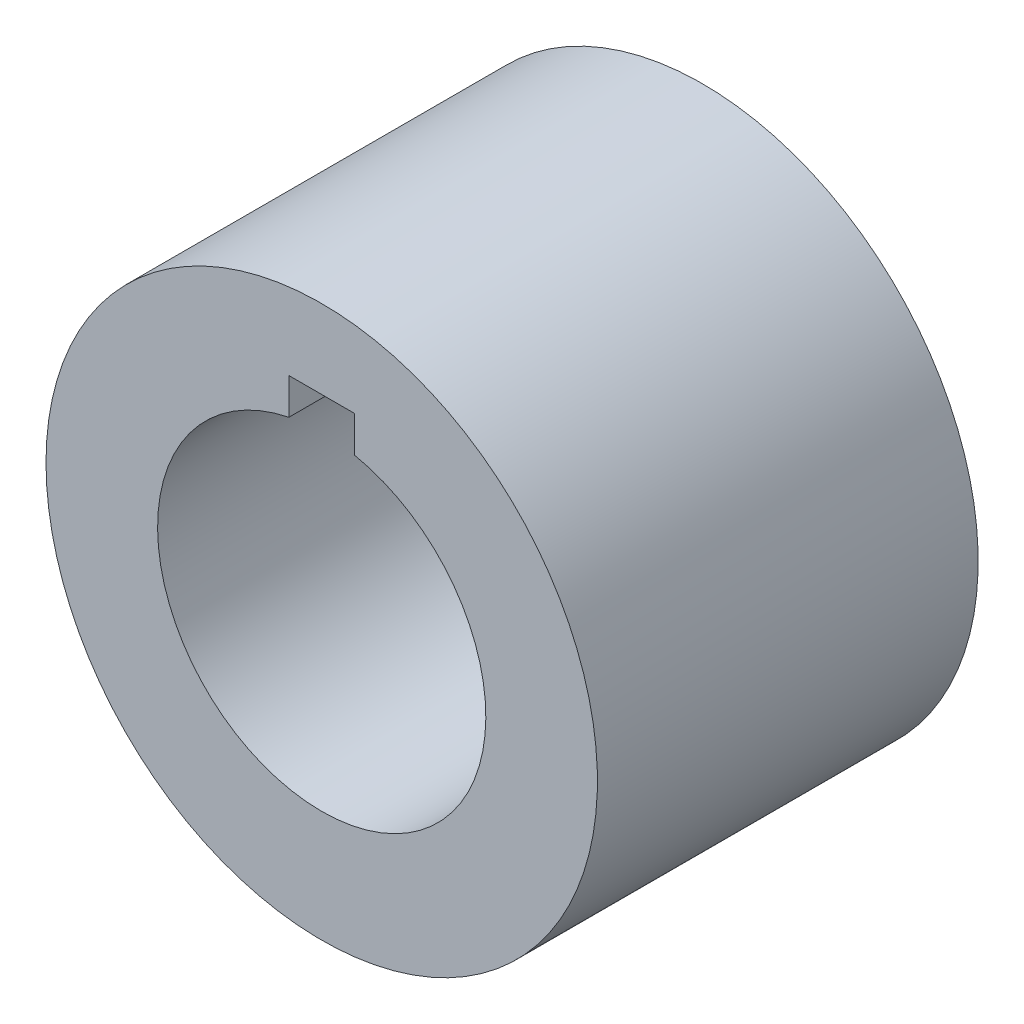
ISO-10303-21;
HEADER;
FILE_DESCRIPTION(('STEP AP214'),'2;1');
FILE_NAME('part.step','',(''),(''),'','','');
FILE_SCHEMA(('AUTOMOTIVE_DESIGN { 1 0 10303 214 1 1 1 1 }'));
ENDSEC;
DATA;
#1=APPLICATION_CONTEXT('core data for automotive mechanical design processes');
#2=APPLICATION_PROTOCOL_DEFINITION('international standard','automotive_design',2000,#1);
#3=PRODUCT_CONTEXT('',#1,'mechanical');
#4=PRODUCT('Part','Part','',(#3));
#5=PRODUCT_RELATED_PRODUCT_CATEGORY('part','',(#4));
#6=PRODUCT_DEFINITION_FORMATION('','',#4);
#7=PRODUCT_DEFINITION_CONTEXT('part definition',#1,'design');
#8=PRODUCT_DEFINITION('design','',#6,#7);
#9=PRODUCT_DEFINITION_SHAPE('','',#8);
#10=(LENGTH_UNIT() NAMED_UNIT(*) SI_UNIT(.MILLI.,.METRE.));
#11=(NAMED_UNIT(*) PLANE_ANGLE_UNIT() SI_UNIT($,.RADIAN.));
#12=(NAMED_UNIT(*) SI_UNIT($,.STERADIAN.) SOLID_ANGLE_UNIT());
#13=UNCERTAINTY_MEASURE_WITH_UNIT(LENGTH_MEASURE(1.E-05),#10,'distance_accuracy_value','');
#14=(GEOMETRIC_REPRESENTATION_CONTEXT(3) GLOBAL_UNCERTAINTY_ASSIGNED_CONTEXT((#13)) GLOBAL_UNIT_ASSIGNED_CONTEXT((#10,
#11,#12)) REPRESENTATION_CONTEXT('',''));
#15=CARTESIAN_POINT('',(0.,0.,0.));
#16=DIRECTION('',(0.,0.,1.));
#17=DIRECTION('',(1.,0.,0.));
#18=AXIS2_PLACEMENT_3D('',#15,#16,#17);
#19=CARTESIAN_POINT('',(0.,0.,29.));
#20=DIRECTION('',(0.,0.,1.));
#21=DIRECTION('',(1.,0.,0.));
#22=AXIS2_PLACEMENT_3D('',#19,#20,#21);
#23=PLANE('',#22);
#24=DIRECTION('',(0.,1.,0.));
#25=VECTOR('',#24,1.);
#26=CARTESIAN_POINT('',(2.5,15.,29.));
#27=LINE('',#26,#25);
#28=CARTESIAN_POINT('',(2.5,12.2474487139159,29.));
#29=VERTEX_POINT('',#28);
#30=CARTESIAN_POINT('',(2.5,15.,29.));
#31=VERTEX_POINT('',#30);
#32=EDGE_CURVE('E107',#29,#31,#27,.T.);
#33=ORIENTED_EDGE('',*,*,#32,.F.);
#34=CARTESIAN_POINT('',(0.,0.,29.));
#35=DIRECTION('',(0.,0.,1.));
#36=DIRECTION('',(1.,0.,0.));
#37=AXIS2_PLACEMENT_3D('',#34,#35,#36);
#38=CIRCLE('',#37,12.5);
#39=CARTESIAN_POINT('',(-2.5,12.2474487139159,29.));
#40=VERTEX_POINT('',#39);
#41=EDGE_CURVE('E125',#40,#29,#38,.T.);
#42=ORIENTED_EDGE('',*,*,#41,.F.);
#43=DIRECTION('',(0.,-1.,0.));
#44=VECTOR('',#43,1.);
#45=CARTESIAN_POINT('',(-2.5,15.,29.));
#46=LINE('',#45,#44);
#47=CARTESIAN_POINT('',(-2.5,15.,29.));
#48=VERTEX_POINT('',#47);
#49=EDGE_CURVE('E104',#48,#40,#46,.T.);
#50=ORIENTED_EDGE('',*,*,#49,.F.);
#51=DIRECTION('',(-1.,0.,0.));
#52=VECTOR('',#51,1.);
#53=CARTESIAN_POINT('',(-2.5,15.,29.));
#54=LINE('',#53,#52);
#55=EDGE_CURVE('E96',#31,#48,#54,.T.);
#56=ORIENTED_EDGE('',*,*,#55,.F.);
#57=EDGE_LOOP('',(#33,#42,#50,#56));
#58=FACE_BOUND('',#57,.T.);
#59=CARTESIAN_POINT('',(0.,0.,29.));
#60=DIRECTION('',(0.,0.,1.));
#61=DIRECTION('',(1.,0.,0.));
#62=AXIS2_PLACEMENT_3D('',#59,#60,#61);
#63=CIRCLE('',#62,21.);
#64=CARTESIAN_POINT('',(-21.,0.,29.));
#65=VERTEX_POINT('',#64);
#66=EDGE_CURVE('E132',#65,#65,#63,.T.);
#67=ORIENTED_EDGE('',*,*,#66,.T.);
#68=EDGE_LOOP('',(#67));
#69=FACE_BOUND('',#68,.T.);
#70=ADVANCED_FACE('F39',(#58,#69),#23,.T.);
#71=CARTESIAN_POINT('',(0.,0.,0.));
#72=DIRECTION('',(0.,0.,1.));
#73=DIRECTION('',(1.,0.,0.));
#74=AXIS2_PLACEMENT_3D('',#71,#72,#73);
#75=PLANE('',#74);
#76=CARTESIAN_POINT('',(0.,0.,0.));
#77=DIRECTION('',(0.,0.,1.));
#78=DIRECTION('',(1.,0.,0.));
#79=AXIS2_PLACEMENT_3D('',#76,#77,#78);
#80=CIRCLE('',#79,21.);
#81=CARTESIAN_POINT('',(-21.,0.,0.));
#82=VERTEX_POINT('',#81);
#83=EDGE_CURVE('E128',#82,#82,#80,.T.);
#84=ORIENTED_EDGE('',*,*,#83,.F.);
#85=EDGE_LOOP('',(#84));
#86=FACE_BOUND('',#85,.T.);
#87=CARTESIAN_POINT('',(0.,0.,0.));
#88=DIRECTION('',(0.,0.,1.));
#89=DIRECTION('',(1.,0.,0.));
#90=AXIS2_PLACEMENT_3D('',#87,#88,#89);
#91=CIRCLE('',#90,12.5);
#92=CARTESIAN_POINT('',(12.5,0.,0.));
#93=VERTEX_POINT('',#92);
#94=EDGE_CURVE('E123',#93,#93,#91,.T.);
#95=ORIENTED_EDGE('',*,*,#94,.T.);
#96=EDGE_LOOP('',(#95));
#97=FACE_BOUND('',#96,.T.);
#98=ADVANCED_FACE('F173',(#86,#97),#75,.F.);
#99=CARTESIAN_POINT('',(0.,0.,29.));
#100=DIRECTION('',(0.,0.,-1.));
#101=DIRECTION('',(-1.,0.,0.));
#102=AXIS2_PLACEMENT_3D('',#99,#100,#101);
#103=CYLINDRICAL_SURFACE('',#102,21.);
#104=CARTESIAN_POINT('',(-21.,0.,29.));
#105=CARTESIAN_POINT('',(-21.,0.,28.6979166666667));
#106=CARTESIAN_POINT('',(-21.,0.,28.3958333333333));
#107=CARTESIAN_POINT('',(-21.,0.,27.7916666666667));
#108=CARTESIAN_POINT('',(-21.,0.,27.4895833333333));
#109=CARTESIAN_POINT('',(-21.,0.,26.8854166666667));
#110=CARTESIAN_POINT('',(-21.,0.,26.5833333333333));
#111=CARTESIAN_POINT('',(-21.,0.,25.9791666666667));
#112=CARTESIAN_POINT('',(-21.,0.,25.6770833333333));
#113=CARTESIAN_POINT('',(-21.,0.,25.0729166666667));
#114=CARTESIAN_POINT('',(-21.,0.,24.7708333333333));
#115=CARTESIAN_POINT('',(-21.,0.,24.1666666666667));
#116=CARTESIAN_POINT('',(-21.,0.,23.8645833333333));
#117=CARTESIAN_POINT('',(-21.,0.,23.2604166666667));
#118=CARTESIAN_POINT('',(-21.,0.,22.9583333333333));
#119=CARTESIAN_POINT('',(-21.,0.,22.3541666666667));
#120=CARTESIAN_POINT('',(-21.,0.,22.0520833333333));
#121=CARTESIAN_POINT('',(-21.,0.,21.4479166666667));
#122=CARTESIAN_POINT('',(-21.,0.,21.1458333333333));
#123=CARTESIAN_POINT('',(-21.,0.,20.5416666666667));
#124=CARTESIAN_POINT('',(-21.,0.,20.2395833333333));
#125=CARTESIAN_POINT('',(-21.,0.,19.6354166666667));
#126=CARTESIAN_POINT('',(-21.,0.,19.3333333333333));
#127=CARTESIAN_POINT('',(-21.,0.,18.7291666666667));
#128=CARTESIAN_POINT('',(-21.,0.,18.4270833333333));
#129=CARTESIAN_POINT('',(-21.,0.,17.8229166666667));
#130=CARTESIAN_POINT('',(-21.,0.,17.5208333333333));
#131=CARTESIAN_POINT('',(-21.,0.,16.9166666666667));
#132=CARTESIAN_POINT('',(-21.,0.,16.6145833333333));
#133=CARTESIAN_POINT('',(-21.,0.,16.0104166666667));
#134=CARTESIAN_POINT('',(-21.,0.,15.7083333333333));
#135=CARTESIAN_POINT('',(-21.,0.,15.1041666666667));
#136=CARTESIAN_POINT('',(-21.,0.,14.8020833333333));
#137=CARTESIAN_POINT('',(-21.,0.,14.1979166666667));
#138=CARTESIAN_POINT('',(-21.,0.,13.8958333333333));
#139=CARTESIAN_POINT('',(-21.,0.,13.2916666666667));
#140=CARTESIAN_POINT('',(-21.,0.,12.9895833333333));
#141=CARTESIAN_POINT('',(-21.,0.,12.3854166666667));
#142=CARTESIAN_POINT('',(-21.,0.,12.0833333333333));
#143=CARTESIAN_POINT('',(-21.,0.,11.4791666666667));
#144=CARTESIAN_POINT('',(-21.,0.,11.1770833333333));
#145=CARTESIAN_POINT('',(-21.,0.,10.5729166666667));
#146=CARTESIAN_POINT('',(-21.,0.,10.2708333333333));
#147=CARTESIAN_POINT('',(-21.,0.,9.66666666666667));
#148=CARTESIAN_POINT('',(-21.,0.,9.36458333333333));
#149=CARTESIAN_POINT('',(-21.,0.,8.76041666666667));
#150=CARTESIAN_POINT('',(-21.,0.,8.45833333333333));
#151=CARTESIAN_POINT('',(-21.,0.,7.85416666666667));
#152=CARTESIAN_POINT('',(-21.,0.,7.55208333333333));
#153=CARTESIAN_POINT('',(-21.,0.,6.94791666666667));
#154=CARTESIAN_POINT('',(-21.,0.,6.64583333333333));
#155=CARTESIAN_POINT('',(-21.,0.,6.04166666666667));
#156=CARTESIAN_POINT('',(-21.,0.,5.73958333333333));
#157=CARTESIAN_POINT('',(-21.,0.,5.13541666666667));
#158=CARTESIAN_POINT('',(-21.,0.,4.83333333333333));
#159=CARTESIAN_POINT('',(-21.,0.,4.22916666666667));
#160=CARTESIAN_POINT('',(-21.,0.,3.92708333333333));
#161=CARTESIAN_POINT('',(-21.,0.,3.32291666666667));
#162=CARTESIAN_POINT('',(-21.,0.,3.02083333333333));
#163=CARTESIAN_POINT('',(-21.,0.,2.41666666666667));
#164=CARTESIAN_POINT('',(-21.,0.,2.11458333333333));
#165=CARTESIAN_POINT('',(-21.,0.,1.51041666666667));
#166=CARTESIAN_POINT('',(-21.,0.,1.20833333333333));
#167=CARTESIAN_POINT('',(-21.,0.,0.604166666666667));
#168=CARTESIAN_POINT('',(-21.,0.,0.302083333333333));
#169=CARTESIAN_POINT('',(-21.,0.,0.));
#170=B_SPLINE_CURVE_WITH_KNOTS('',3,(#104,#105,#106,#107,#108,#109,#110,#111,#112,#113,#114,
#115,#116,#117,#118,#119,#120,#121,#122,#123,#124,#125,#126,#127,#128,#129,#130,#131,#132,#133,
#134,#135,#136,#137,#138,#139,#140,#141,#142,#143,#144,#145,#146,#147,#148,#149,#150,#151,#152,
#153,#154,#155,#156,#157,#158,#159,#160,#161,#162,#163,#164,#165,#166,#167,#168,#169),
.UNSPECIFIED.,.F.,.F.,(4,2,2,2,2,2,2,2,2,2,2,2,2,2,2,2,2,2,2,2,2,2,2,2,2,2,2,2,2,2,2,2,4),(0.,
0.906250000000001,1.8125,2.71875,3.625,4.53125,5.4375,6.34375,7.25,8.15625,9.0625,9.96875,
10.875,11.78125,12.6875,13.59375,14.5,15.40625,16.3125,17.21875,18.125,19.03125,19.9375,
20.84375,21.75,22.65625,23.5625,24.46875,25.375,26.28125,27.1875,28.09375,29.),.UNSPECIFIED.);
#171=EDGE_CURVE('BSEAM168',#65,#82,#170,.T.);
#172=ORIENTED_EDGE('',*,*,#66,.F.);
#173=ORIENTED_EDGE('',*,*,#83,.T.);
#174=ORIENTED_EDGE('',*,*,#171,.T.);
#175=ORIENTED_EDGE('',*,*,#171,.F.);
#176=EDGE_LOOP('',(#172,#174,#173,#175));
#177=FACE_BOUND('',#176,.T.);
#178=ADVANCED_FACE('F168',(#177),#103,.T.);
#179=CARTESIAN_POINT('',(0.,0.,29.));
#180=DIRECTION('',(0.,0.,-1.));
#181=DIRECTION('',(-1.,0.,0.));
#182=AXIS2_PLACEMENT_3D('',#179,#180,#181);
#183=CYLINDRICAL_SURFACE('',#182,12.5);
#184=DIRECTION('',(0.,0.,-1.));
#185=VECTOR('',#184,1.);
#186=CARTESIAN_POINT('',(2.5,12.2474487139159,29.));
#187=LINE('',#186,#185);
#188=CARTESIAN_POINT('',(2.5,12.2474487139159,6.00000000000001));
#189=VERTEX_POINT('',#188);
#190=EDGE_CURVE('E110',#189,#29,#187,.F.);
#191=ORIENTED_EDGE('',*,*,#190,.F.);
#192=CARTESIAN_POINT('',(2.5,12.2474487139159,6.));
#193=CARTESIAN_POINT('',(2.50000755453493,12.2474426861993,5.93043388757112));
#194=CARTESIAN_POINT('',(2.49709642012808,12.2480412905018,5.86087194586643));
#195=CARTESIAN_POINT('',(2.48549536781789,12.2504031311909,5.72225987695974));
#196=CARTESIAN_POINT('',(2.47680616538598,12.2521662233842,5.65320968746011));
#197=CARTESIAN_POINT('',(2.45372579449014,12.2568087575412,5.51621544923126));
#198=CARTESIAN_POINT('',(2.43934365783788,12.2596864310724,5.44826982501945));
#199=CARTESIAN_POINT('',(2.40500480115988,12.2664687508979,5.3138739604459));
#200=CARTESIAN_POINT('',(2.38504805870512,12.2703734013241,5.24742372610192));
#201=CARTESIAN_POINT('',(2.31701335206159,12.2834691332585,5.05099699721422));
#202=CARTESIAN_POINT('',(2.26075289171316,12.2940458508606,4.92383836344421));
#203=CARTESIAN_POINT('',(2.12813168468194,12.317693059,4.68081360676116));
#204=CARTESIAN_POINT('',(2.05176831878758,12.3307638744328,4.56494895804115));
#205=CARTESIAN_POINT('',(1.87995451296325,12.3581315302874,4.34610975627201));
#206=CARTESIAN_POINT('',(1.78427688143249,12.3724416817023,4.24331492507515));
#207=CARTESIAN_POINT('',(1.57702890912138,12.400560223314,4.05511468060791));
#208=CARTESIAN_POINT('',(1.46545557207307,12.414368518296,3.96971255317299));
#209=CARTESIAN_POINT('',(1.22837080969079,12.4400737464369,3.81800765495776));
#210=CARTESIAN_POINT('',(1.10274341116264,12.4519524370665,3.75188294875678));
#211=CARTESIAN_POINT('',(0.841913818366615,12.4722989738708,3.64178355275673));
#212=CARTESIAN_POINT('',(0.70671841758775,12.4807692121105,3.59779332344854));
#213=CARTESIAN_POINT('',(0.475632170774576,12.4912961292167,3.54379632954174));
#214=CARTESIAN_POINT('',(0.381240776561996,12.4945424227324,3.52739213834566));
#215=CARTESIAN_POINT('',(0.191248149324902,12.4989018425699,3.50549034733465));
#216=CARTESIAN_POINT('',(0.0956482028037174,12.5000170718343,3.4999819952734));
#217=CARTESIAN_POINT('',(0.,12.5,3.5));
#218=B_SPLINE_CURVE_WITH_KNOTS('',3,(#192,#193,#194,#195,#196,#197,#198,#199,#200,#201,#202,
#203,#204,#205,#206,#207,#208,#209,#210,#211,#212,#213,#214,#215,#216,#217),.UNSPECIFIED.,.F.,
.F.,(4,2,2,2,2,2,2,2,2,2,2,2,4),(0.,0.208627589483974,0.417229350387237,0.625501483603755,
0.833774454800563,1.25000135900362,1.66628252035583,2.08778016170978,2.50935735882325,
2.93471348409769,3.35977056999609,3.64674172455571,3.93342954830302),.UNSPECIFIED.);
#219=CARTESIAN_POINT('',(0.,12.5,3.5));
#220=VERTEX_POINT('',#219);
#221=EDGE_CURVE('E153',#189,#220,#218,.T.);
#222=ORIENTED_EDGE('',*,*,#221,.T.);
#223=CARTESIAN_POINT('',(0.,12.5,3.5));
#224=CARTESIAN_POINT('',(-0.0695802030869723,12.5000055699289,3.49999247903647));
#225=CARTESIAN_POINT('',(-0.139156314119516,12.4994191533962,3.5029047595202));
#226=CARTESIAN_POINT('',(-0.277797519839005,12.4971035949608,3.51451061975572));
#227=CARTESIAN_POINT('',(-0.346862674146696,12.4953745885771,3.52320351388791));
#228=CARTESIAN_POINT('',(-0.483889669216019,12.4908186108826,3.54629442694215));
#229=CARTESIAN_POINT('',(-0.551853053195525,12.4879933443444,3.56068358841143));
#230=CARTESIAN_POINT('',(-0.686284662792135,12.4813281321479,3.59503989220123));
#231=CARTESIAN_POINT('',(-0.752752884312886,12.4774881837102,3.615007049802));
#232=CARTESIAN_POINT('',(-0.949236267530969,12.4645939361752,3.6830795491288));
#233=CARTESIAN_POINT('',(-1.07643295512981,12.4541615851656,3.73937337540527));
#234=CARTESIAN_POINT('',(-1.31952057156152,12.4307616960465,3.87207256823003));
#235=CARTESIAN_POINT('',(-1.43541019628972,12.4177938660234,3.94848025086869));
#236=CARTESIAN_POINT('',(-1.65422116650007,12.3905551289591,4.12033920156434));
#237=CARTESIAN_POINT('',(-1.75697048873883,12.3762704702664,4.21600767931055));
#238=CARTESIAN_POINT('',(-1.94508296444328,12.348106170118,4.42321856577606));
#239=CARTESIAN_POINT('',(-2.03044260860097,12.3342266108964,4.53476417086468));
#240=CARTESIAN_POINT('',(-2.18210203469897,12.3083071166309,4.77182360899524));
#241=CARTESIAN_POINT('',(-2.24821621796945,12.2962855880002,4.89745825115047));
#242=CARTESIAN_POINT('',(-2.35829367785653,12.275650976889,5.15830240659292));
#243=CARTESIAN_POINT('',(-2.40227281327788,12.2670354551039,5.29350498542489));
#244=CARTESIAN_POINT('',(-2.45623933103384,12.2563201506375,5.52456082344954));
#245=CARTESIAN_POINT('',(-2.47262982198914,12.2530125834783,5.61891207546966));
#246=CARTESIAN_POINT('',(-2.49451394841941,12.248568649972,5.80882685163573));
#247=CARTESIAN_POINT('',(-2.50001807649253,12.2474301930112,5.90438911905266));
#248=CARTESIAN_POINT('',(-2.5,12.2474487139159,6.));
#249=B_SPLINE_CURVE_WITH_KNOTS('',3,(#223,#224,#225,#226,#227,#228,#229,#230,#231,#232,#233,
#234,#235,#236,#237,#238,#239,#240,#241,#242,#243,#244,#245,#246,#247,#248),.UNSPECIFIED.,.F.,
.F.,(4,2,2,2,2,2,2,2,2,2,2,2,4),(0.,0.208670054655722,0.417315364055163,0.625637505285634,
0.833960217194826,1.25029655151824,1.66668084753888,2.08805424015666,2.50951258359396,
2.93491006499075,3.36000233207991,3.64685414082024,3.9334293383216),.UNSPECIFIED.);
#250=CARTESIAN_POINT('',(-2.5,12.2474487139159,6.00000000000001));
#251=VERTEX_POINT('',#250);
#252=EDGE_CURVE('E11',#220,#251,#249,.T.);
#253=ORIENTED_EDGE('',*,*,#252,.T.);
#254=DIRECTION('',(0.,0.,-1.));
#255=VECTOR('',#254,1.);
#256=CARTESIAN_POINT('',(-2.5,12.2474487139159,29.));
#257=LINE('',#256,#255);
#258=EDGE_CURVE('E136',#40,#251,#257,.T.);
#259=ORIENTED_EDGE('',*,*,#258,.F.);
#260=ORIENTED_EDGE('',*,*,#41,.T.);
#261=EDGE_LOOP('',(#191,#222,#253,#259,#260));
#262=FACE_BOUND('',#261,.T.);
#263=ORIENTED_EDGE('',*,*,#94,.F.);
#264=EDGE_LOOP('',(#263));
#265=FACE_BOUND('',#264,.T.);
#266=ADVANCED_FACE('F163',(#262,#265),#183,.F.);
#267=CARTESIAN_POINT('',(2.5,15.,3.5));
#268=DIRECTION('',(1.,0.,0.));
#269=DIRECTION('',(0.,1.,0.));
#270=AXIS2_PLACEMENT_3D('',#267,#268,#269);
#271=PLANE('',#270);
#272=DIRECTION('',(0.,0.,1.));
#273=VECTOR('',#272,1.);
#274=CARTESIAN_POINT('',(2.5,15.,3.5));
#275=LINE('',#274,#273);
#276=CARTESIAN_POINT('',(2.5,15.,6.));
#277=VERTEX_POINT('',#276);
#278=EDGE_CURVE('E92',#277,#31,#275,.T.);
#279=ORIENTED_EDGE('',*,*,#278,.F.);
#280=DIRECTION('',(0.,1.,0.));
#281=VECTOR('',#280,1.);
#282=CARTESIAN_POINT('',(2.5,15.,6.));
#283=LINE('',#282,#281);
#284=EDGE_CURVE('E150',#277,#189,#283,.F.);
#285=ORIENTED_EDGE('',*,*,#284,.T.);
#286=ORIENTED_EDGE('',*,*,#190,.T.);
#287=ORIENTED_EDGE('',*,*,#32,.T.);
#288=EDGE_LOOP('',(#279,#285,#286,#287));
#289=FACE_BOUND('',#288,.T.);
#290=ADVANCED_FACE('F108',(#289),#271,.F.);
#291=CARTESIAN_POINT('',(-2.5,15.,3.5));
#292=DIRECTION('',(-1.,0.,0.));
#293=DIRECTION('',(0.,-1.,0.));
#294=AXIS2_PLACEMENT_3D('',#291,#292,#293);
#295=PLANE('',#294);
#296=ORIENTED_EDGE('',*,*,#258,.T.);
#297=DIRECTION('',(0.,-1.,0.));
#298=VECTOR('',#297,1.);
#299=CARTESIAN_POINT('',(-2.5,15.,6.));
#300=LINE('',#299,#298);
#301=CARTESIAN_POINT('',(-2.5,15.,6.));
#302=VERTEX_POINT('',#301);
#303=EDGE_CURVE('E61',#251,#302,#300,.F.);
#304=ORIENTED_EDGE('',*,*,#303,.T.);
#305=DIRECTION('',(0.,0.,1.));
#306=VECTOR('',#305,1.);
#307=CARTESIAN_POINT('',(-2.5,15.,3.5));
#308=LINE('',#307,#306);
#309=EDGE_CURVE('E103',#302,#48,#308,.T.);
#310=ORIENTED_EDGE('',*,*,#309,.T.);
#311=ORIENTED_EDGE('',*,*,#49,.T.);
#312=EDGE_LOOP('',(#296,#304,#310,#311));
#313=FACE_BOUND('',#312,.T.);
#314=ADVANCED_FACE('F200',(#313),#295,.F.);
#315=CARTESIAN_POINT('',(-2.5,15.,3.5));
#316=DIRECTION('',(0.,1.,0.));
#317=DIRECTION('',(0.,0.,1.));
#318=AXIS2_PLACEMENT_3D('',#315,#316,#317);
#319=PLANE('',#318);
#320=ORIENTED_EDGE('',*,*,#309,.F.);
#321=CARTESIAN_POINT('',(0.,15.,6.));
#322=DIRECTION('',(0.,1.,0.));
#323=DIRECTION('',(0.,0.,1.));
#324=AXIS2_PLACEMENT_3D('',#321,#322,#323);
#325=CIRCLE('',#324,2.5);
#326=CARTESIAN_POINT('',(0.,15.,3.5));
#327=VERTEX_POINT('',#326);
#328=EDGE_CURVE('E54',#302,#327,#325,.F.);
#329=ORIENTED_EDGE('',*,*,#328,.T.);
#330=CARTESIAN_POINT('',(0.,15.,6.));
#331=DIRECTION('',(0.,1.,0.));
#332=DIRECTION('',(0.,0.,1.));
#333=AXIS2_PLACEMENT_3D('',#330,#331,#332);
#334=CIRCLE('',#333,2.5);
#335=EDGE_CURVE('E99',#327,#277,#334,.F.);
#336=ORIENTED_EDGE('',*,*,#335,.T.);
#337=ORIENTED_EDGE('',*,*,#278,.T.);
#338=ORIENTED_EDGE('',*,*,#55,.T.);
#339=EDGE_LOOP('',(#320,#329,#336,#337,#338));
#340=FACE_BOUND('',#339,.T.);
#341=ADVANCED_FACE('F94',(#340),#319,.F.);
#342=CARTESIAN_POINT('',(0.,0.,6.));
#343=DIRECTION('',(0.,1.,0.));
#344=DIRECTION('',(-1.,0.,0.));
#345=AXIS2_PLACEMENT_3D('',#342,#343,#344);
#346=CYLINDRICAL_SURFACE('',#345,2.5);
#347=ORIENTED_EDGE('',*,*,#221,.F.);
#348=ORIENTED_EDGE('',*,*,#284,.F.);
#349=ORIENTED_EDGE('',*,*,#335,.F.);
#350=DIRECTION('',(0.,1.,0.));
#351=VECTOR('',#350,1.);
#352=CARTESIAN_POINT('',(0.,0.,3.5));
#353=LINE('',#352,#351);
#354=EDGE_CURVE('E144',#220,#327,#353,.T.);
#355=ORIENTED_EDGE('',*,*,#354,.F.);
#356=EDGE_LOOP('',(#347,#348,#349,#355));
#357=FACE_BOUND('',#356,.T.);
#358=ADVANCED_FACE('F160',(#357),#346,.F.);
#359=CARTESIAN_POINT('',(0.,0.,6.));
#360=DIRECTION('',(0.,-1.,0.));
#361=DIRECTION('',(1.,0.,0.));
#362=AXIS2_PLACEMENT_3D('',#359,#360,#361);
#363=CYLINDRICAL_SURFACE('',#362,2.5);
#364=ORIENTED_EDGE('',*,*,#328,.F.);
#365=ORIENTED_EDGE('',*,*,#303,.F.);
#366=ORIENTED_EDGE('',*,*,#252,.F.);
#367=ORIENTED_EDGE('',*,*,#354,.T.);
#368=EDGE_LOOP('',(#364,#365,#366,#367));
#369=FACE_BOUND('',#368,.T.);
#370=ADVANCED_FACE('F41',(#369),#363,.F.);
#371=CLOSED_SHELL('',(#70,#98,#178,#266,#290,#314,#341,#358,#370));
#372=MANIFOLD_SOLID_BREP('B2',#371);
#373=ADVANCED_BREP_SHAPE_REPRESENTATION('',(#18,#372),#14);
#374=SHAPE_DEFINITION_REPRESENTATION(#9,#373);
ENDSEC;
END-ISO-10303-21;
